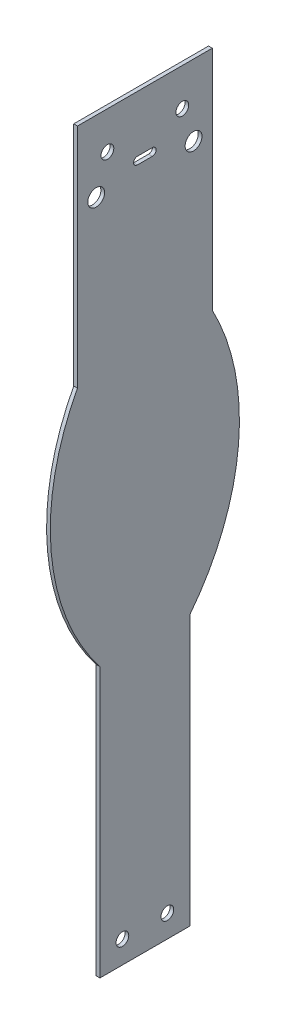
ISO-10303-21;
HEADER;
FILE_DESCRIPTION(('STEP AP214'),'2;1');
FILE_NAME('part.step','',(''),(''),'','','');
FILE_SCHEMA(('AUTOMOTIVE_DESIGN { 1 0 10303 214 1 1 1 1 }'));
ENDSEC;
DATA;
#1=APPLICATION_CONTEXT('core data for automotive mechanical design processes');
#2=APPLICATION_PROTOCOL_DEFINITION('international standard','automotive_design',2000,#1);
#3=PRODUCT_CONTEXT('',#1,'mechanical');
#4=PRODUCT('Part','Part','',(#3));
#5=PRODUCT_RELATED_PRODUCT_CATEGORY('part','',(#4));
#6=PRODUCT_DEFINITION_FORMATION('','',#4);
#7=PRODUCT_DEFINITION_CONTEXT('part definition',#1,'design');
#8=PRODUCT_DEFINITION('design','',#6,#7);
#9=PRODUCT_DEFINITION_SHAPE('','',#8);
#10=(LENGTH_UNIT() NAMED_UNIT(*) SI_UNIT(.MILLI.,.METRE.));
#11=(NAMED_UNIT(*) PLANE_ANGLE_UNIT() SI_UNIT($,.RADIAN.));
#12=(NAMED_UNIT(*) SI_UNIT($,.STERADIAN.) SOLID_ANGLE_UNIT());
#13=UNCERTAINTY_MEASURE_WITH_UNIT(LENGTH_MEASURE(1.E-05),#10,'distance_accuracy_value','');
#14=(GEOMETRIC_REPRESENTATION_CONTEXT(3) GLOBAL_UNCERTAINTY_ASSIGNED_CONTEXT((#13)) GLOBAL_UNIT_ASSIGNED_CONTEXT((#10,
#11,#12)) REPRESENTATION_CONTEXT('',''));
#15=CARTESIAN_POINT('',(0.,0.,0.));
#16=DIRECTION('',(0.,0.,1.));
#17=DIRECTION('',(1.,0.,0.));
#18=AXIS2_PLACEMENT_3D('',#15,#16,#17);
#19=CARTESIAN_POINT('',(1.,0.,18.));
#20=DIRECTION('',(0.,0.,-1.));
#21=DIRECTION('',(0.,1.,0.));
#22=AXIS2_PLACEMENT_3D('',#19,#20,#21);
#23=PLANE('',#22);
#24=DIRECTION('',(0.,-1.,0.));
#25=VECTOR('',#24,1.);
#26=CARTESIAN_POINT('',(0.,0.,18.));
#27=LINE('',#26,#25);
#28=CARTESIAN_POINT('',(0.,0.,18.));
#29=VERTEX_POINT('',#28);
#30=CARTESIAN_POINT('',(0.,-60.6171169772276,18.));
#31=VERTEX_POINT('',#30);
#32=EDGE_CURVE('E186',#29,#31,#27,.T.);
#33=ORIENTED_EDGE('',*,*,#32,.T.);
#34=DIRECTION('',(-1.,0.,0.));
#35=VECTOR('',#34,1.);
#36=CARTESIAN_POINT('',(1.,-60.6171169772276,18.));
#37=LINE('',#36,#35);
#38=CARTESIAN_POINT('',(1.,-60.6171169772276,18.));
#39=VERTEX_POINT('',#38);
#40=EDGE_CURVE('E11',#39,#31,#37,.T.);
#41=ORIENTED_EDGE('',*,*,#40,.F.);
#42=DIRECTION('',(0.,-1.,0.));
#43=VECTOR('',#42,1.);
#44=CARTESIAN_POINT('',(1.,0.,18.));
#45=LINE('',#44,#43);
#46=CARTESIAN_POINT('',(1.,0.,18.));
#47=VERTEX_POINT('',#46);
#48=EDGE_CURVE('E187',#47,#39,#45,.T.);
#49=ORIENTED_EDGE('',*,*,#48,.F.);
#50=DIRECTION('',(-1.,0.,0.));
#51=VECTOR('',#50,1.);
#52=CARTESIAN_POINT('',(1.,0.,18.));
#53=LINE('',#52,#51);
#54=EDGE_CURVE('E210',#47,#29,#53,.T.);
#55=ORIENTED_EDGE('',*,*,#54,.T.);
#56=EDGE_LOOP('',(#33,#41,#49,#55));
#57=FACE_BOUND('',#56,.T.);
#58=ADVANCED_FACE('F35',(#57),#23,.F.);
#59=CARTESIAN_POINT('',(1.,-89.7000591872467,-36.7556615557578));
#60=DIRECTION('',(-1.,0.,0.));
#61=DIRECTION('',(0.,0.,1.));
#62=AXIS2_PLACEMENT_3D('',#59,#60,#61);
#63=CYLINDRICAL_SURFACE('',#62,62.);
#64=CARTESIAN_POINT('',(0.,-89.7000591872467,-36.7556615557578));
#65=DIRECTION('',(1.,0.,0.));
#66=DIRECTION('',(0.,0.,-1.));
#67=AXIS2_PLACEMENT_3D('',#64,#65,#66);
#68=CIRCLE('',#67,62.);
#69=CARTESIAN_POINT('',(0.,-128.,12.));
#70=VERTEX_POINT('',#69);
#71=EDGE_CURVE('E213',#31,#70,#68,.T.);
#72=ORIENTED_EDGE('',*,*,#71,.T.);
#73=DIRECTION('',(-1.,0.,0.));
#74=VECTOR('',#73,1.);
#75=CARTESIAN_POINT('',(1.,-128.,12.));
#76=LINE('',#75,#74);
#77=CARTESIAN_POINT('',(1.,-128.,12.));
#78=VERTEX_POINT('',#77);
#79=EDGE_CURVE('E42',#78,#70,#76,.T.);
#80=ORIENTED_EDGE('',*,*,#79,.F.);
#81=CARTESIAN_POINT('',(1.,-89.7000591872467,-36.7556615557578));
#82=DIRECTION('',(1.,0.,0.));
#83=DIRECTION('',(0.,0.,-1.));
#84=AXIS2_PLACEMENT_3D('',#81,#82,#83);
#85=CIRCLE('',#84,62.);
#86=EDGE_CURVE('E190',#39,#78,#85,.T.);
#87=ORIENTED_EDGE('',*,*,#86,.F.);
#88=ORIENTED_EDGE('',*,*,#40,.T.);
#89=EDGE_LOOP('',(#72,#80,#87,#88));
#90=FACE_BOUND('',#89,.T.);
#91=ADVANCED_FACE('F249',(#90),#63,.T.);
#92=CARTESIAN_POINT('',(1.,-200.,12.));
#93=DIRECTION('',(0.,0.,1.));
#94=DIRECTION('',(1.,0.,0.));
#95=AXIS2_PLACEMENT_3D('',#92,#93,#94);
#96=PLANE('',#95);
#97=DIRECTION('',(0.,1.,0.));
#98=VECTOR('',#97,1.);
#99=CARTESIAN_POINT('',(0.,-200.,12.));
#100=LINE('',#99,#98);
#101=CARTESIAN_POINT('',(0.,-200.,12.));
#102=VERTEX_POINT('',#101);
#103=EDGE_CURVE('E216',#102,#70,#100,.T.);
#104=ORIENTED_EDGE('',*,*,#103,.F.);
#105=DIRECTION('',(-1.,0.,0.));
#106=VECTOR('',#105,1.);
#107=CARTESIAN_POINT('',(1.,-200.,12.));
#108=LINE('',#107,#106);
#109=CARTESIAN_POINT('',(1.,-200.,12.));
#110=VERTEX_POINT('',#109);
#111=EDGE_CURVE('E242',#110,#102,#108,.T.);
#112=ORIENTED_EDGE('',*,*,#111,.F.);
#113=DIRECTION('',(0.,1.,0.));
#114=VECTOR('',#113,1.);
#115=CARTESIAN_POINT('',(1.,-200.,12.));
#116=LINE('',#115,#114);
#117=EDGE_CURVE('E193',#110,#78,#116,.T.);
#118=ORIENTED_EDGE('',*,*,#117,.T.);
#119=ORIENTED_EDGE('',*,*,#79,.T.);
#120=EDGE_LOOP('',(#104,#112,#118,#119));
#121=FACE_BOUND('',#120,.T.);
#122=ADVANCED_FACE('F246',(#121),#96,.T.);
#123=CARTESIAN_POINT('',(1.,-200.,-12.));
#124=DIRECTION('',(0.,-1.,0.));
#125=DIRECTION('',(0.,0.,-1.));
#126=AXIS2_PLACEMENT_3D('',#123,#124,#125);
#127=PLANE('',#126);
#128=DIRECTION('',(0.,0.,1.));
#129=VECTOR('',#128,1.);
#130=CARTESIAN_POINT('',(0.,-200.,-12.));
#131=LINE('',#130,#129);
#132=CARTESIAN_POINT('',(0.,-200.,-12.));
#133=VERTEX_POINT('',#132);
#134=EDGE_CURVE('E219',#133,#102,#131,.T.);
#135=ORIENTED_EDGE('',*,*,#134,.F.);
#136=DIRECTION('',(-1.,0.,0.));
#137=VECTOR('',#136,1.);
#138=CARTESIAN_POINT('',(1.,-200.,-12.));
#139=LINE('',#138,#137);
#140=CARTESIAN_POINT('',(1.,-200.,-12.));
#141=VERTEX_POINT('',#140);
#142=EDGE_CURVE('E240',#141,#133,#139,.T.);
#143=ORIENTED_EDGE('',*,*,#142,.F.);
#144=DIRECTION('',(0.,0.,1.));
#145=VECTOR('',#144,1.);
#146=CARTESIAN_POINT('',(1.,-200.,-12.));
#147=LINE('',#146,#145);
#148=EDGE_CURVE('E196',#141,#110,#147,.T.);
#149=ORIENTED_EDGE('',*,*,#148,.T.);
#150=ORIENTED_EDGE('',*,*,#111,.T.);
#151=EDGE_LOOP('',(#135,#143,#149,#150));
#152=FACE_BOUND('',#151,.T.);
#153=ADVANCED_FACE('F256',(#152),#127,.T.);
#154=CARTESIAN_POINT('',(1.,-200.,-12.));
#155=DIRECTION('',(0.,0.,1.));
#156=DIRECTION('',(1.,0.,0.));
#157=AXIS2_PLACEMENT_3D('',#154,#155,#156);
#158=PLANE('',#157);
#159=DIRECTION('',(0.,1.,0.));
#160=VECTOR('',#159,1.);
#161=CARTESIAN_POINT('',(0.,-200.,-12.));
#162=LINE('',#161,#160);
#163=CARTESIAN_POINT('',(0.,-128.,-12.));
#164=VERTEX_POINT('',#163);
#165=EDGE_CURVE('E222',#133,#164,#162,.T.);
#166=ORIENTED_EDGE('',*,*,#165,.T.);
#167=DIRECTION('',(-1.,0.,0.));
#168=VECTOR('',#167,1.);
#169=CARTESIAN_POINT('',(1.,-128.,-12.));
#170=LINE('',#169,#168);
#171=CARTESIAN_POINT('',(1.,-128.,-12.));
#172=VERTEX_POINT('',#171);
#173=EDGE_CURVE('E238',#172,#164,#170,.T.);
#174=ORIENTED_EDGE('',*,*,#173,.F.);
#175=DIRECTION('',(0.,1.,0.));
#176=VECTOR('',#175,1.);
#177=CARTESIAN_POINT('',(1.,-200.,-12.));
#178=LINE('',#177,#176);
#179=EDGE_CURVE('E199',#141,#172,#178,.T.);
#180=ORIENTED_EDGE('',*,*,#179,.F.);
#181=ORIENTED_EDGE('',*,*,#142,.T.);
#182=EDGE_LOOP('',(#166,#174,#180,#181));
#183=FACE_BOUND('',#182,.T.);
#184=ADVANCED_FACE('F277',(#183),#158,.F.);
#185=CARTESIAN_POINT('',(1.,-89.7000591872467,36.7556615557578));
#186=DIRECTION('',(-1.,0.,0.));
#187=DIRECTION('',(0.,0.,1.));
#188=AXIS2_PLACEMENT_3D('',#185,#186,#187);
#189=CYLINDRICAL_SURFACE('',#188,62.);
#190=CARTESIAN_POINT('',(0.,-89.7000591872467,36.7556615557578));
#191=DIRECTION('',(-1.,0.,0.));
#192=DIRECTION('',(0.,0.,1.));
#193=AXIS2_PLACEMENT_3D('',#190,#191,#192);
#194=CIRCLE('',#193,62.);
#195=CARTESIAN_POINT('',(0.,-60.6171169772276,-18.));
#196=VERTEX_POINT('',#195);
#197=EDGE_CURVE('E225',#196,#164,#194,.T.);
#198=ORIENTED_EDGE('',*,*,#197,.F.);
#199=DIRECTION('',(-1.,0.,0.));
#200=VECTOR('',#199,1.);
#201=CARTESIAN_POINT('',(1.,-60.6171169772276,-18.));
#202=LINE('',#201,#200);
#203=CARTESIAN_POINT('',(1.,-60.6171169772276,-18.));
#204=VERTEX_POINT('',#203);
#205=EDGE_CURVE('E236',#204,#196,#202,.T.);
#206=ORIENTED_EDGE('',*,*,#205,.F.);
#207=CARTESIAN_POINT('',(1.,-89.7000591872467,36.7556615557578));
#208=DIRECTION('',(-1.,0.,0.));
#209=DIRECTION('',(0.,0.,1.));
#210=AXIS2_PLACEMENT_3D('',#207,#208,#209);
#211=CIRCLE('',#210,62.);
#212=EDGE_CURVE('E201',#204,#172,#211,.T.);
#213=ORIENTED_EDGE('',*,*,#212,.T.);
#214=ORIENTED_EDGE('',*,*,#173,.T.);
#215=EDGE_LOOP('',(#198,#206,#213,#214));
#216=FACE_BOUND('',#215,.T.);
#217=ADVANCED_FACE('F273',(#216),#189,.T.);
#218=CARTESIAN_POINT('',(1.,0.,-18.));
#219=DIRECTION('',(0.,0.,-1.));
#220=DIRECTION('',(0.,1.,0.));
#221=AXIS2_PLACEMENT_3D('',#218,#219,#220);
#222=PLANE('',#221);
#223=DIRECTION('',(0.,-1.,0.));
#224=VECTOR('',#223,1.);
#225=CARTESIAN_POINT('',(0.,0.,-18.));
#226=LINE('',#225,#224);
#227=CARTESIAN_POINT('',(0.,0.,-18.));
#228=VERTEX_POINT('',#227);
#229=EDGE_CURVE('E228',#228,#196,#226,.T.);
#230=ORIENTED_EDGE('',*,*,#229,.F.);
#231=DIRECTION('',(-1.,0.,0.));
#232=VECTOR('',#231,1.);
#233=CARTESIAN_POINT('',(1.,0.,-18.));
#234=LINE('',#233,#232);
#235=CARTESIAN_POINT('',(1.,0.,-18.));
#236=VERTEX_POINT('',#235);
#237=EDGE_CURVE('E234',#236,#228,#234,.T.);
#238=ORIENTED_EDGE('',*,*,#237,.F.);
#239=DIRECTION('',(0.,-1.,0.));
#240=VECTOR('',#239,1.);
#241=CARTESIAN_POINT('',(1.,0.,-18.));
#242=LINE('',#241,#240);
#243=EDGE_CURVE('E204',#236,#204,#242,.T.);
#244=ORIENTED_EDGE('',*,*,#243,.T.);
#245=ORIENTED_EDGE('',*,*,#205,.T.);
#246=EDGE_LOOP('',(#230,#238,#244,#245));
#247=FACE_BOUND('',#246,.T.);
#248=ADVANCED_FACE('F270',(#247),#222,.T.);
#249=CARTESIAN_POINT('',(1.,0.,18.));
#250=DIRECTION('',(0.,1.,0.));
#251=DIRECTION('',(0.,0.,1.));
#252=AXIS2_PLACEMENT_3D('',#249,#250,#251);
#253=PLANE('',#252);
#254=DIRECTION('',(0.,0.,-1.));
#255=VECTOR('',#254,1.);
#256=CARTESIAN_POINT('',(0.,0.,18.));
#257=LINE('',#256,#255);
#258=EDGE_CURVE('E191',#29,#228,#257,.T.);
#259=ORIENTED_EDGE('',*,*,#258,.F.);
#260=ORIENTED_EDGE('',*,*,#54,.F.);
#261=DIRECTION('',(0.,0.,-1.));
#262=VECTOR('',#261,1.);
#263=CARTESIAN_POINT('',(1.,0.,18.));
#264=LINE('',#263,#262);
#265=EDGE_CURVE('E207',#47,#236,#264,.T.);
#266=ORIENTED_EDGE('',*,*,#265,.T.);
#267=ORIENTED_EDGE('',*,*,#237,.T.);
#268=EDGE_LOOP('',(#259,#260,#266,#267));
#269=FACE_BOUND('',#268,.T.);
#270=ADVANCED_FACE('F267',(#269),#253,.T.);
#271=CARTESIAN_POINT('',(1.,-89.7000591872467,-36.7556615557578));
#272=DIRECTION('',(1.,0.,0.));
#273=DIRECTION('',(0.,0.,-1.));
#274=AXIS2_PLACEMENT_3D('',#271,#272,#273);
#275=PLANE('',#274);
#276=CARTESIAN_POINT('',(1.,-194.,6.));
#277=DIRECTION('',(1.,0.,0.));
#278=DIRECTION('',(0.,0.,-1.));
#279=AXIS2_PLACEMENT_3D('',#276,#277,#278);
#280=CIRCLE('',#279,1.69999999999998);
#281=CARTESIAN_POINT('',(1.,-194.,4.30000000000002));
#282=VERTEX_POINT('',#281);
#283=EDGE_CURVE('E415',#282,#282,#280,.T.);
#284=ORIENTED_EDGE('',*,*,#283,.F.);
#285=EDGE_LOOP('',(#284));
#286=FACE_BOUND('',#285,.T.);
#287=CARTESIAN_POINT('',(1.,-194.,-6.));
#288=DIRECTION('',(1.,0.,0.));
#289=DIRECTION('',(0.,0.,-1.));
#290=AXIS2_PLACEMENT_3D('',#287,#288,#289);
#291=CIRCLE('',#290,1.69999999999998);
#292=CARTESIAN_POINT('',(1.,-194.,-7.69999999999998));
#293=VERTEX_POINT('',#292);
#294=EDGE_CURVE('E417',#293,#293,#291,.T.);
#295=ORIENTED_EDGE('',*,*,#294,.F.);
#296=EDGE_LOOP('',(#295));
#297=FACE_BOUND('',#296,.T.);
#298=CARTESIAN_POINT('',(1.,-16.,2.));
#299=DIRECTION('',(1.,0.,0.));
#300=DIRECTION('',(0.,0.,-1.));
#301=AXIS2_PLACEMENT_3D('',#298,#299,#300);
#302=CIRCLE('',#301,1.);
#303=CARTESIAN_POINT('',(1.,-15.,2.));
#304=VERTEX_POINT('',#303);
#305=CARTESIAN_POINT('',(1.,-17.,2.));
#306=VERTEX_POINT('',#305);
#307=EDGE_CURVE('E49',#304,#306,#302,.T.);
#308=ORIENTED_EDGE('',*,*,#307,.F.);
#309=DIRECTION('',(0.,0.,1.));
#310=VECTOR('',#309,1.);
#311=CARTESIAN_POINT('',(1.,-15.,2.));
#312=LINE('',#311,#310);
#313=CARTESIAN_POINT('',(1.,-15.,-2.));
#314=VERTEX_POINT('',#313);
#315=EDGE_CURVE('E141',#314,#304,#312,.T.);
#316=ORIENTED_EDGE('',*,*,#315,.F.);
#317=CARTESIAN_POINT('',(1.,-16.,-2.));
#318=DIRECTION('',(1.,0.,0.));
#319=DIRECTION('',(0.,0.,-1.));
#320=AXIS2_PLACEMENT_3D('',#317,#318,#319);
#321=CIRCLE('',#320,1.);
#322=CARTESIAN_POINT('',(1.,-17.,-2.));
#323=VERTEX_POINT('',#322);
#324=EDGE_CURVE('E144',#323,#314,#321,.T.);
#325=ORIENTED_EDGE('',*,*,#324,.F.);
#326=DIRECTION('',(0.,0.,-1.));
#327=VECTOR('',#326,1.);
#328=CARTESIAN_POINT('',(1.,-17.,2.));
#329=LINE('',#328,#327);
#330=EDGE_CURVE('E153',#306,#323,#329,.T.);
#331=ORIENTED_EDGE('',*,*,#330,.F.);
#332=EDGE_LOOP('',(#308,#316,#325,#331));
#333=FACE_BOUND('',#332,.T.);
#334=CARTESIAN_POINT('',(1.,-19.,-13.));
#335=DIRECTION('',(-1.,0.,0.));
#336=DIRECTION('',(0.,0.,1.));
#337=AXIS2_PLACEMENT_3D('',#334,#335,#336);
#338=CIRCLE('',#337,2.25);
#339=CARTESIAN_POINT('',(1.,-19.,-10.75));
#340=VERTEX_POINT('',#339);
#341=EDGE_CURVE('E165',#340,#340,#338,.T.);
#342=ORIENTED_EDGE('',*,*,#341,.T.);
#343=EDGE_LOOP('',(#342));
#344=FACE_BOUND('',#343,.T.);
#345=CARTESIAN_POINT('',(1.,-19.,13.));
#346=DIRECTION('',(-1.,0.,0.));
#347=DIRECTION('',(0.,0.,1.));
#348=AXIS2_PLACEMENT_3D('',#345,#346,#347);
#349=CIRCLE('',#348,2.25);
#350=CARTESIAN_POINT('',(1.,-19.,15.25));
#351=VERTEX_POINT('',#350);
#352=EDGE_CURVE('E171',#351,#351,#349,.T.);
#353=ORIENTED_EDGE('',*,*,#352,.T.);
#354=EDGE_LOOP('',(#353));
#355=FACE_BOUND('',#354,.T.);
#356=CARTESIAN_POINT('',(1.,-10.,10.));
#357=DIRECTION('',(-1.,0.,0.));
#358=DIRECTION('',(0.,0.,1.));
#359=AXIS2_PLACEMENT_3D('',#356,#357,#358);
#360=CIRCLE('',#359,1.7);
#361=CARTESIAN_POINT('',(1.,-10.,11.7));
#362=VERTEX_POINT('',#361);
#363=EDGE_CURVE('E177',#362,#362,#360,.T.);
#364=ORIENTED_EDGE('',*,*,#363,.T.);
#365=EDGE_LOOP('',(#364));
#366=FACE_BOUND('',#365,.T.);
#367=CARTESIAN_POINT('',(1.,-10.,-10.));
#368=DIRECTION('',(-1.,0.,0.));
#369=DIRECTION('',(0.,0.,1.));
#370=AXIS2_PLACEMENT_3D('',#367,#368,#369);
#371=CIRCLE('',#370,1.7);
#372=CARTESIAN_POINT('',(1.,-10.,-8.3));
#373=VERTEX_POINT('',#372);
#374=EDGE_CURVE('E183',#373,#373,#371,.T.);
#375=ORIENTED_EDGE('',*,*,#374,.T.);
#376=EDGE_LOOP('',(#375));
#377=FACE_BOUND('',#376,.T.);
#378=ORIENTED_EDGE('',*,*,#48,.T.);
#379=ORIENTED_EDGE('',*,*,#86,.T.);
#380=ORIENTED_EDGE('',*,*,#117,.F.);
#381=ORIENTED_EDGE('',*,*,#148,.F.);
#382=ORIENTED_EDGE('',*,*,#179,.T.);
#383=ORIENTED_EDGE('',*,*,#212,.F.);
#384=ORIENTED_EDGE('',*,*,#243,.F.);
#385=ORIENTED_EDGE('',*,*,#265,.F.);
#386=EDGE_LOOP('',(#378,#379,#380,#381,#382,#383,#384,#385));
#387=FACE_BOUND('',#386,.T.);
#388=ADVANCED_FACE('F260',(#286,#297,#333,#344,#355,#366,#377,#387),#275,.T.);
#389=CARTESIAN_POINT('',(0.,-89.7000591872467,-36.7556615557578));
#390=DIRECTION('',(1.,0.,0.));
#391=DIRECTION('',(0.,0.,-1.));
#392=AXIS2_PLACEMENT_3D('',#389,#390,#391);
#393=PLANE('',#392);
#394=CARTESIAN_POINT('',(0.,-194.,6.));
#395=DIRECTION('',(1.,0.,0.));
#396=DIRECTION('',(0.,0.,-1.));
#397=AXIS2_PLACEMENT_3D('',#394,#395,#396);
#398=CIRCLE('',#397,1.70000000000001);
#399=CARTESIAN_POINT('',(0.,-194.,4.29999999999999));
#400=VERTEX_POINT('',#399);
#401=EDGE_CURVE('E412',#400,#400,#398,.T.);
#402=ORIENTED_EDGE('',*,*,#401,.T.);
#403=EDGE_LOOP('',(#402));
#404=FACE_BOUND('',#403,.T.);
#405=CARTESIAN_POINT('',(0.,-194.,-6.));
#406=DIRECTION('',(1.,0.,0.));
#407=DIRECTION('',(0.,0.,-1.));
#408=AXIS2_PLACEMENT_3D('',#405,#406,#407);
#409=CIRCLE('',#408,1.70000000000001);
#410=CARTESIAN_POINT('',(0.,-194.,-7.70000000000001));
#411=VERTEX_POINT('',#410);
#412=EDGE_CURVE('E147',#411,#411,#409,.T.);
#413=ORIENTED_EDGE('',*,*,#412,.T.);
#414=EDGE_LOOP('',(#413));
#415=FACE_BOUND('',#414,.T.);
#416=DIRECTION('',(0.,0.,1.));
#417=VECTOR('',#416,1.);
#418=CARTESIAN_POINT('',(0.,-15.,2.));
#419=LINE('',#418,#417);
#420=CARTESIAN_POINT('',(0.,-15.,-2.));
#421=VERTEX_POINT('',#420);
#422=CARTESIAN_POINT('',(0.,-15.,2.));
#423=VERTEX_POINT('',#422);
#424=EDGE_CURVE('E131',#421,#423,#419,.T.);
#425=ORIENTED_EDGE('',*,*,#424,.T.);
#426=CARTESIAN_POINT('',(0.,-16.,2.));
#427=DIRECTION('',(1.,0.,0.));
#428=DIRECTION('',(0.,0.,-1.));
#429=AXIS2_PLACEMENT_3D('',#426,#427,#428);
#430=CIRCLE('',#429,1.);
#431=CARTESIAN_POINT('',(0.,-17.,2.));
#432=VERTEX_POINT('',#431);
#433=EDGE_CURVE('E125',#423,#432,#430,.T.);
#434=ORIENTED_EDGE('',*,*,#433,.T.);
#435=DIRECTION('',(0.,0.,-1.));
#436=VECTOR('',#435,1.);
#437=CARTESIAN_POINT('',(0.,-17.,2.));
#438=LINE('',#437,#436);
#439=CARTESIAN_POINT('',(0.,-17.,-2.));
#440=VERTEX_POINT('',#439);
#441=EDGE_CURVE('E134',#432,#440,#438,.T.);
#442=ORIENTED_EDGE('',*,*,#441,.T.);
#443=CARTESIAN_POINT('',(0.,-16.,-2.));
#444=DIRECTION('',(1.,0.,0.));
#445=DIRECTION('',(0.,0.,-1.));
#446=AXIS2_PLACEMENT_3D('',#443,#444,#445);
#447=CIRCLE('',#446,1.);
#448=EDGE_CURVE('E57',#440,#421,#447,.T.);
#449=ORIENTED_EDGE('',*,*,#448,.T.);
#450=EDGE_LOOP('',(#425,#434,#442,#449));
#451=FACE_BOUND('',#450,.T.);
#452=CARTESIAN_POINT('',(0.,-19.,-13.));
#453=DIRECTION('',(-1.,0.,0.));
#454=DIRECTION('',(0.,0.,1.));
#455=AXIS2_PLACEMENT_3D('',#452,#453,#454);
#456=CIRCLE('',#455,2.25);
#457=CARTESIAN_POINT('',(0.,-19.,-10.75));
#458=VERTEX_POINT('',#457);
#459=EDGE_CURVE('E159',#458,#458,#456,.T.);
#460=ORIENTED_EDGE('',*,*,#459,.F.);
#461=EDGE_LOOP('',(#460));
#462=FACE_BOUND('',#461,.T.);
#463=CARTESIAN_POINT('',(0.,-19.,13.));
#464=DIRECTION('',(-1.,0.,0.));
#465=DIRECTION('',(0.,0.,1.));
#466=AXIS2_PLACEMENT_3D('',#463,#464,#465);
#467=CIRCLE('',#466,2.25);
#468=CARTESIAN_POINT('',(0.,-19.,15.25));
#469=VERTEX_POINT('',#468);
#470=EDGE_CURVE('E168',#469,#469,#467,.T.);
#471=ORIENTED_EDGE('',*,*,#470,.F.);
#472=EDGE_LOOP('',(#471));
#473=FACE_BOUND('',#472,.T.);
#474=CARTESIAN_POINT('',(0.,-10.,10.));
#475=DIRECTION('',(-1.,0.,0.));
#476=DIRECTION('',(0.,0.,1.));
#477=AXIS2_PLACEMENT_3D('',#474,#475,#476);
#478=CIRCLE('',#477,1.69999999999999);
#479=CARTESIAN_POINT('',(0.,-10.,11.7));
#480=VERTEX_POINT('',#479);
#481=EDGE_CURVE('E174',#480,#480,#478,.T.);
#482=ORIENTED_EDGE('',*,*,#481,.F.);
#483=EDGE_LOOP('',(#482));
#484=FACE_BOUND('',#483,.T.);
#485=CARTESIAN_POINT('',(0.,-10.,-10.));
#486=DIRECTION('',(-1.,0.,0.));
#487=DIRECTION('',(0.,0.,1.));
#488=AXIS2_PLACEMENT_3D('',#485,#486,#487);
#489=CIRCLE('',#488,1.69999999999999);
#490=CARTESIAN_POINT('',(0.,-10.,-8.30000000000001));
#491=VERTEX_POINT('',#490);
#492=EDGE_CURVE('E180',#491,#491,#489,.T.);
#493=ORIENTED_EDGE('',*,*,#492,.F.);
#494=EDGE_LOOP('',(#493));
#495=FACE_BOUND('',#494,.T.);
#496=ORIENTED_EDGE('',*,*,#32,.F.);
#497=ORIENTED_EDGE('',*,*,#258,.T.);
#498=ORIENTED_EDGE('',*,*,#229,.T.);
#499=ORIENTED_EDGE('',*,*,#197,.T.);
#500=ORIENTED_EDGE('',*,*,#165,.F.);
#501=ORIENTED_EDGE('',*,*,#134,.T.);
#502=ORIENTED_EDGE('',*,*,#103,.T.);
#503=ORIENTED_EDGE('',*,*,#71,.F.);
#504=EDGE_LOOP('',(#496,#497,#498,#499,#500,#501,#502,#503));
#505=FACE_BOUND('',#504,.T.);
#506=ADVANCED_FACE('F138',(#404,#415,#451,#462,#473,#484,#495,#505),#393,.F.);
#507=CARTESIAN_POINT('',(0.,-10.,-10.));
#508=DIRECTION('',(-1.,0.,0.));
#509=DIRECTION('',(0.,0.,1.));
#510=AXIS2_PLACEMENT_3D('',#507,#508,#509);
#511=CYLINDRICAL_SURFACE('',#510,1.69999999999999);
#512=ORIENTED_EDGE('',*,*,#374,.F.);
#513=EDGE_LOOP('',(#512));
#514=FACE_BOUND('',#513,.T.);
#515=ORIENTED_EDGE('',*,*,#492,.T.);
#516=EDGE_LOOP('',(#515));
#517=FACE_BOUND('',#516,.T.);
#518=ADVANCED_FACE('F332',(#514,#517),#511,.F.);
#519=CARTESIAN_POINT('',(0.,-10.,10.));
#520=DIRECTION('',(-1.,0.,0.));
#521=DIRECTION('',(0.,0.,1.));
#522=AXIS2_PLACEMENT_3D('',#519,#520,#521);
#523=CYLINDRICAL_SURFACE('',#522,1.69999999999999);
#524=ORIENTED_EDGE('',*,*,#363,.F.);
#525=EDGE_LOOP('',(#524));
#526=FACE_BOUND('',#525,.T.);
#527=ORIENTED_EDGE('',*,*,#481,.T.);
#528=EDGE_LOOP('',(#527));
#529=FACE_BOUND('',#528,.T.);
#530=ADVANCED_FACE('F340',(#526,#529),#523,.F.);
#531=CARTESIAN_POINT('',(0.,-19.,13.));
#532=DIRECTION('',(-1.,0.,0.));
#533=DIRECTION('',(0.,0.,1.));
#534=AXIS2_PLACEMENT_3D('',#531,#532,#533);
#535=CYLINDRICAL_SURFACE('',#534,2.25);
#536=ORIENTED_EDGE('',*,*,#352,.F.);
#537=EDGE_LOOP('',(#536));
#538=FACE_BOUND('',#537,.T.);
#539=ORIENTED_EDGE('',*,*,#470,.T.);
#540=EDGE_LOOP('',(#539));
#541=FACE_BOUND('',#540,.T.);
#542=ADVANCED_FACE('F348',(#538,#541),#535,.F.);
#543=CARTESIAN_POINT('',(0.,-19.,-13.));
#544=DIRECTION('',(-1.,0.,0.));
#545=DIRECTION('',(0.,0.,1.));
#546=AXIS2_PLACEMENT_3D('',#543,#544,#545);
#547=CYLINDRICAL_SURFACE('',#546,2.25);
#548=ORIENTED_EDGE('',*,*,#341,.F.);
#549=EDGE_LOOP('',(#548));
#550=FACE_BOUND('',#549,.T.);
#551=ORIENTED_EDGE('',*,*,#459,.T.);
#552=EDGE_LOOP('',(#551));
#553=FACE_BOUND('',#552,.T.);
#554=ADVANCED_FACE('F356',(#550,#553),#547,.F.);
#555=CARTESIAN_POINT('',(0.,-16.,2.));
#556=DIRECTION('',(1.,0.,0.));
#557=DIRECTION('',(0.,0.,-1.));
#558=AXIS2_PLACEMENT_3D('',#555,#556,#557);
#559=CYLINDRICAL_SURFACE('',#558,1.);
#560=ORIENTED_EDGE('',*,*,#307,.T.);
#561=DIRECTION('',(1.,0.,0.));
#562=VECTOR('',#561,1.);
#563=CARTESIAN_POINT('',(0.,-17.,2.));
#564=LINE('',#563,#562);
#565=EDGE_CURVE('E121',#432,#306,#564,.T.);
#566=ORIENTED_EDGE('',*,*,#565,.F.);
#567=ORIENTED_EDGE('',*,*,#433,.F.);
#568=DIRECTION('',(1.,0.,0.));
#569=VECTOR('',#568,1.);
#570=CARTESIAN_POINT('',(0.,-15.,2.));
#571=LINE('',#570,#569);
#572=EDGE_CURVE('E157',#423,#304,#571,.T.);
#573=ORIENTED_EDGE('',*,*,#572,.T.);
#574=EDGE_LOOP('',(#560,#566,#567,#573));
#575=FACE_BOUND('',#574,.T.);
#576=ADVANCED_FACE('F123',(#575),#559,.F.);
#577=CARTESIAN_POINT('',(0.,-15.,2.));
#578=DIRECTION('',(0.,1.,0.));
#579=DIRECTION('',(0.,0.,1.));
#580=AXIS2_PLACEMENT_3D('',#577,#578,#579);
#581=PLANE('',#580);
#582=ORIENTED_EDGE('',*,*,#315,.T.);
#583=ORIENTED_EDGE('',*,*,#572,.F.);
#584=ORIENTED_EDGE('',*,*,#424,.F.);
#585=DIRECTION('',(1.,0.,0.));
#586=VECTOR('',#585,1.);
#587=CARTESIAN_POINT('',(0.,-15.,-2.));
#588=LINE('',#587,#586);
#589=EDGE_CURVE('E160',#421,#314,#588,.T.);
#590=ORIENTED_EDGE('',*,*,#589,.T.);
#591=EDGE_LOOP('',(#582,#583,#584,#590));
#592=FACE_BOUND('',#591,.T.);
#593=ADVANCED_FACE('F371',(#592),#581,.F.);
#594=CARTESIAN_POINT('',(0.,-16.,-2.));
#595=DIRECTION('',(1.,0.,0.));
#596=DIRECTION('',(0.,0.,-1.));
#597=AXIS2_PLACEMENT_3D('',#594,#595,#596);
#598=CYLINDRICAL_SURFACE('',#597,1.);
#599=ORIENTED_EDGE('',*,*,#324,.T.);
#600=ORIENTED_EDGE('',*,*,#589,.F.);
#601=ORIENTED_EDGE('',*,*,#448,.F.);
#602=DIRECTION('',(1.,0.,0.));
#603=VECTOR('',#602,1.);
#604=CARTESIAN_POINT('',(0.,-17.,-2.));
#605=LINE('',#604,#603);
#606=EDGE_CURVE('E130',#440,#323,#605,.T.);
#607=ORIENTED_EDGE('',*,*,#606,.T.);
#608=EDGE_LOOP('',(#599,#600,#601,#607));
#609=FACE_BOUND('',#608,.T.);
#610=ADVANCED_FACE('F378',(#609),#598,.F.);
#611=CARTESIAN_POINT('',(0.,-17.,2.));
#612=DIRECTION('',(0.,-1.,0.));
#613=DIRECTION('',(0.,0.,-1.));
#614=AXIS2_PLACEMENT_3D('',#611,#612,#613);
#615=PLANE('',#614);
#616=ORIENTED_EDGE('',*,*,#330,.T.);
#617=ORIENTED_EDGE('',*,*,#606,.F.);
#618=ORIENTED_EDGE('',*,*,#441,.F.);
#619=ORIENTED_EDGE('',*,*,#565,.T.);
#620=EDGE_LOOP('',(#616,#617,#618,#619));
#621=FACE_BOUND('',#620,.T.);
#622=ADVANCED_FACE('F135',(#621),#615,.F.);
#623=CARTESIAN_POINT('',(1.,-194.,-6.));
#624=DIRECTION('',(1.,0.,0.));
#625=DIRECTION('',(0.,0.,-1.));
#626=AXIS2_PLACEMENT_3D('',#623,#624,#625);
#627=CYLINDRICAL_SURFACE('',#626,1.69999999999999);
#628=ORIENTED_EDGE('',*,*,#412,.F.);
#629=EDGE_LOOP('',(#628));
#630=FACE_BOUND('',#629,.T.);
#631=ORIENTED_EDGE('',*,*,#294,.T.);
#632=EDGE_LOOP('',(#631));
#633=FACE_BOUND('',#632,.T.);
#634=ADVANCED_FACE('F392',(#630,#633),#627,.F.);
#635=CARTESIAN_POINT('',(1.,-194.,6.));
#636=DIRECTION('',(1.,0.,0.));
#637=DIRECTION('',(0.,0.,-1.));
#638=AXIS2_PLACEMENT_3D('',#635,#636,#637);
#639=CYLINDRICAL_SURFACE('',#638,1.69999999999999);
#640=ORIENTED_EDGE('',*,*,#401,.F.);
#641=EDGE_LOOP('',(#640));
#642=FACE_BOUND('',#641,.T.);
#643=ORIENTED_EDGE('',*,*,#283,.T.);
#644=EDGE_LOOP('',(#643));
#645=FACE_BOUND('',#644,.T.);
#646=ADVANCED_FACE('F399',(#642,#645),#639,.F.);
#647=CLOSED_SHELL('',(#58,#91,#122,#153,#184,#217,#248,#270,#388,#506,#518,#530,#542,#554,#576,
#593,#610,#622,#634,#646));
#648=MANIFOLD_SOLID_BREP('B2',#647);
#649=ADVANCED_BREP_SHAPE_REPRESENTATION('',(#18,#648),#14);
#650=SHAPE_DEFINITION_REPRESENTATION(#9,#649);
ENDSEC;
END-ISO-10303-21;
